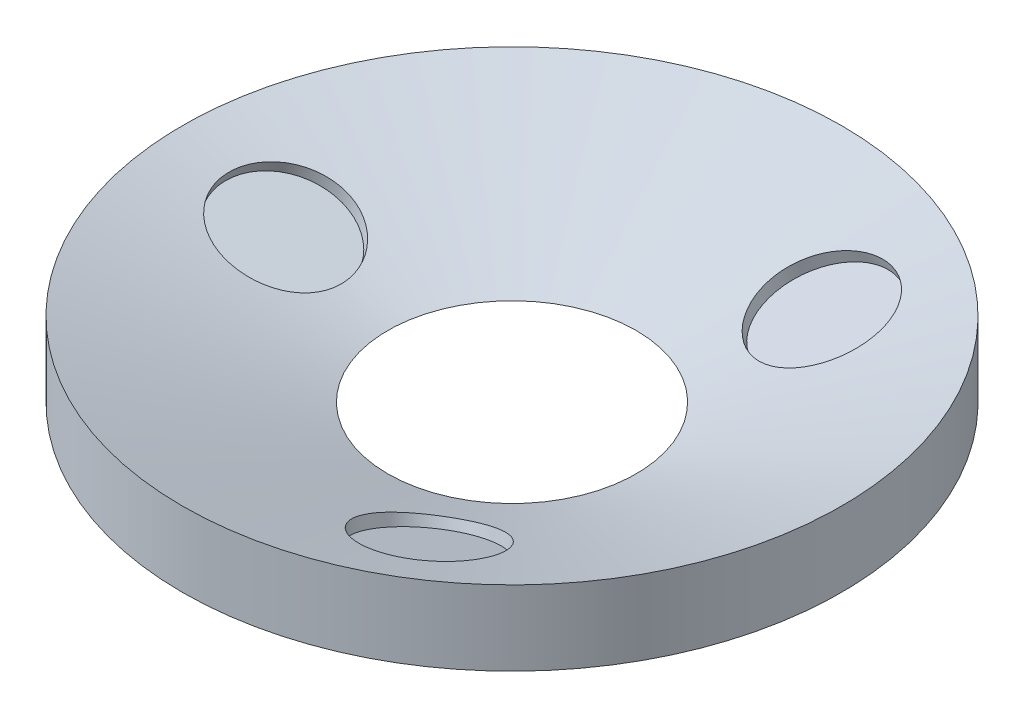
ISO-10303-21;
HEADER;
FILE_DESCRIPTION(('STEP AP214'),'2;1');
FILE_NAME('part.step','',(''),(''),'','','');
FILE_SCHEMA(('AUTOMOTIVE_DESIGN { 1 0 10303 214 1 1 1 1 }'));
ENDSEC;
DATA;
#1=APPLICATION_CONTEXT('core data for automotive mechanical design processes');
#2=APPLICATION_PROTOCOL_DEFINITION('international standard','automotive_design',2000,#1);
#3=PRODUCT_CONTEXT('',#1,'mechanical');
#4=PRODUCT('Part','Part','',(#3));
#5=PRODUCT_RELATED_PRODUCT_CATEGORY('part','',(#4));
#6=PRODUCT_DEFINITION_FORMATION('','',#4);
#7=PRODUCT_DEFINITION_CONTEXT('part definition',#1,'design');
#8=PRODUCT_DEFINITION('design','',#6,#7);
#9=PRODUCT_DEFINITION_SHAPE('','',#8);
#10=(LENGTH_UNIT() NAMED_UNIT(*) SI_UNIT(.MILLI.,.METRE.));
#11=(NAMED_UNIT(*) PLANE_ANGLE_UNIT() SI_UNIT($,.RADIAN.));
#12=(NAMED_UNIT(*) SI_UNIT($,.STERADIAN.) SOLID_ANGLE_UNIT());
#13=UNCERTAINTY_MEASURE_WITH_UNIT(LENGTH_MEASURE(1.E-05),#10,'distance_accuracy_value','');
#14=(GEOMETRIC_REPRESENTATION_CONTEXT(3) GLOBAL_UNCERTAINTY_ASSIGNED_CONTEXT((#13)) GLOBAL_UNIT_ASSIGNED_CONTEXT((#10,
#11,#12)) REPRESENTATION_CONTEXT('',''));
#15=CARTESIAN_POINT('',(0.,0.,0.));
#16=DIRECTION('',(0.,0.,1.));
#17=DIRECTION('',(1.,0.,0.));
#18=AXIS2_PLACEMENT_3D('',#15,#16,#17);
#19=CARTESIAN_POINT('',(0.,0.,0.));
#20=DIRECTION('',(0.,1.,0.));
#21=DIRECTION('',(0.,0.,1.));
#22=AXIS2_PLACEMENT_3D('',#19,#20,#21);
#23=CONICAL_SURFACE('',#22,26.,1.22173047639604);
#24=CARTESIAN_POINT('',(0.,15.6507200734464,0.));
#25=DIRECTION('',(0.,-1.,0.));
#26=DIRECTION('',(0.,0.,-1.));
#27=AXIS2_PLACEMENT_3D('',#24,#25,#26);
#28=CIRCLE('',#27,69.);
#29=CARTESIAN_POINT('',(0.,15.6507200734464,-69.));
#30=VERTEX_POINT('',#29);
#31=EDGE_CURVE('E10',#30,#30,#28,.T.);
#32=ORIENTED_EDGE('',*,*,#31,.F.);
#33=EDGE_LOOP('',(#32));
#34=FACE_BOUND('',#33,.T.);
#35=CARTESIAN_POINT('',(0.,0.,0.));
#36=DIRECTION('',(0.,-1.,0.));
#37=DIRECTION('',(0.,0.,-1.));
#38=AXIS2_PLACEMENT_3D('',#35,#36,#37);
#39=CIRCLE('',#38,26.);
#40=CARTESIAN_POINT('',(0.,0.,-26.));
#41=VERTEX_POINT('',#40);
#42=EDGE_CURVE('E52',#41,#41,#39,.T.);
#43=ORIENTED_EDGE('',*,*,#42,.T.);
#44=EDGE_LOOP('',(#43));
#45=FACE_BOUND('',#44,.T.);
#46=CARTESIAN_POINT('',(-48.6648824369267,8.81686921798829,-12.4175025220033));
#47=CARTESIAN_POINT('',(-48.9950931227915,8.92970028979996,-12.3772225399078));
#48=CARTESIAN_POINT('',(-49.3240113731133,9.04090877423315,-12.3222351855022));
#49=CARTESIAN_POINT('',(-49.9770535959025,9.25955189976981,-12.1832306697217));
#50=CARTESIAN_POINT('',(-50.3011763541219,9.36698559422977,-12.0992062828684));
#51=CARTESIAN_POINT('',(-50.9424648534416,9.5775968115045,-11.9026388857529));
#52=CARTESIAN_POINT('',(-51.2596231259274,9.68076986055038,-11.7900667428155));
#53=CARTESIAN_POINT('',(-51.8843163814544,9.88224095996404,-11.5372571893245));
#54=CARTESIAN_POINT('',(-52.1918513851953,9.9805390208182,-11.3970198382837));
#55=CARTESIAN_POINT('',(-52.7948669511792,10.1717450389196,-11.0899691416754));
#56=CARTESIAN_POINT('',(-53.0903541756035,10.2646559874675,-10.92317074122));
#57=CARTESIAN_POINT('',(-53.6672908182578,10.4447299934216,-10.5641245830231));
#58=CARTESIAN_POINT('',(-53.9487400310327,10.5318929667085,-10.3718764529593));
#59=CARTESIAN_POINT('',(-54.4954608603386,10.7000691770928,-9.96334219331167));
#60=CARTESIAN_POINT('',(-54.7607362828263,10.7810838620894,-9.74706175299703));
#61=CARTESIAN_POINT('',(-55.2732269325638,10.9366423495319,-9.29195333535134));
#62=CARTESIAN_POINT('',(-55.5204422080982,11.0111861692781,-9.05312541830588));
#63=CARTESIAN_POINT('',(-55.9953640076766,11.1536069841588,-8.55420950845172));
#64=CARTESIAN_POINT('',(-56.223038986372,11.2214732241131,-8.29408841546503));
#65=CARTESIAN_POINT('',(-56.6567485587905,11.3501273859672,-7.75475425309283));
#66=CARTESIAN_POINT('',(-56.8627831081847,11.4109152933677,-7.47554114460064));
#67=CARTESIAN_POINT('',(-57.2516807690818,11.5251698415749,-6.89998953002352));
#68=CARTESIAN_POINT('',(-57.4345430951755,11.5786362342281,-6.60365044395892));
#69=CARTESIAN_POINT('',(-57.7757179151459,11.6780322070992,-5.99595649958366));
#70=CARTESIAN_POINT('',(-57.9340304423263,11.7239617975415,-5.68460166164379));
#71=CARTESIAN_POINT('',(-58.224795058821,11.8080679171869,-5.04934972216914));
#72=CARTESIAN_POINT('',(-58.3572683455107,11.8462508024874,-4.72546316475327));
#73=CARTESIAN_POINT('',(-58.5955179480081,11.9147609294281,-4.0672091546438));
#74=CARTESIAN_POINT('',(-58.7012942708721,11.9450881731447,-3.73284170472041));
#75=CARTESIAN_POINT('',(-58.8853482739702,11.9977679142267,-3.05601270396631));
#76=CARTESIAN_POINT('',(-58.9636263172404,12.0201205168746,-2.71355126005729));
#77=CARTESIAN_POINT('',(-59.0920915037068,12.0567641514716,-2.02297502282297));
#78=CARTESIAN_POINT('',(-59.1422786956436,12.0710551974084,-1.67486023930787));
#79=CARTESIAN_POINT('',(-59.2140974168271,12.0914962855886,-0.976276252454742));
#80=CARTESIAN_POINT('',(-59.235794786043,12.0976650984006,-0.625814365584563));
#81=CARTESIAN_POINT('',(-59.2506844914417,12.1018990382395,0.0757629878464422));
#82=CARTESIAN_POINT('',(-59.2438768732205,12.0999641782288,0.426878453360923));
#83=CARTESIAN_POINT('',(-59.2018084616218,12.0879983569221,1.12725876711));
#84=CARTESIAN_POINT('',(-59.1665479157761,12.0779674660591,1.47652363141764));
#85=CARTESIAN_POINT('',(-59.0678411051002,12.0498486356474,2.17071913213656));
#86=CARTESIAN_POINT('',(-59.0043948422807,12.0317606966733,2.51564976885701));
#87=CARTESIAN_POINT('',(-58.8498666670146,11.9876181308799,3.19841389557413));
#88=CARTESIAN_POINT('',(-58.7588098504288,11.9615707384228,3.53625353382632));
#89=CARTESIAN_POINT('',(-58.5497264926574,11.901604954276,4.20276354674748));
#90=CARTESIAN_POINT('',(-58.4316999757698,11.8676865696775,4.53143392967704));
#91=CARTESIAN_POINT('',(-58.1695621271013,11.792110635325,5.17728400967493));
#92=CARTESIAN_POINT('',(-58.0254506040067,11.7504530288097,5.49446362244671));
#93=CARTESIAN_POINT('',(-57.7122208540447,11.6595617010654,6.11509238700896));
#94=CARTESIAN_POINT('',(-57.5431025864547,11.6103279674991,6.41854151643876));
#95=CARTESIAN_POINT('',(-57.1808346834279,11.5043950131912,7.01003700927711));
#96=CARTESIAN_POINT('',(-56.9876477599018,11.4476842005503,7.29805845928199));
#97=CARTESIAN_POINT('',(-56.5788895001451,11.3270828256693,7.85615483110361));
#98=CARTESIAN_POINT('',(-56.3633181441284,11.2631922570829,8.12622973705667));
#99=CARTESIAN_POINT('',(-55.9113858260012,11.1284880411246,8.64653530501179));
#100=CARTESIAN_POINT('',(-55.6750245998558,11.057674305826,8.89676571490847));
#101=CARTESIAN_POINT('',(-55.1832604096045,10.9094144459762,9.37561805353446));
#102=CARTESIAN_POINT('',(-54.92785741882,10.8319683121326,9.60423995198796));
#103=CARTESIAN_POINT('',(-54.399313108855,10.6705911207871,10.0387399801321));
#104=CARTESIAN_POINT('',(-54.126134253971,10.5866462646529,10.244567327756));
#105=CARTESIAN_POINT('',(-53.5645558607898,10.4127815768269,10.6314440367663));
#106=CARTESIAN_POINT('',(-53.2761562971058,10.3228617351693,10.8124933568233));
#107=CARTESIAN_POINT('',(-52.6862603014054,10.1374457394397,11.1485276924738));
#108=CARTESIAN_POINT('',(-52.3847638212957,10.0419495648904,11.3035126123457));
#109=CARTESIAN_POINT('',(-51.7708943155517,9.84582010804752,11.586310677145));
#110=CARTESIAN_POINT('',(-51.4585212983726,9.74518682974731,11.7141238431946));
#111=CARTESIAN_POINT('',(-50.8252202556476,9.53927211444439,11.9416521159608));
#112=CARTESIAN_POINT('',(-50.5042928722142,9.43399102593104,12.0413693251666));
#113=CARTESIAN_POINT('',(-49.8562205674092,9.21930006681213,12.2119970813682));
#114=CARTESIAN_POINT('',(-49.5290756442112,9.1098901949937,12.2829076199017));
#115=CARTESIAN_POINT('',(-48.8709784202367,8.88751793856807,12.3954032712119));
#116=CARTESIAN_POINT('',(-48.5400261785894,8.77455560908484,12.4369888387938));
#117=CARTESIAN_POINT('',(-47.8767403373077,8.54570212954013,12.4905280201258));
#118=CARTESIAN_POINT('',(-47.5444067411763,8.42981098690204,12.5024817089735));
#119=CARTESIAN_POINT('',(-46.8817392867905,8.1961114648469,12.4966719096352));
#120=CARTESIAN_POINT('',(-46.5514024289007,8.07830948510409,12.4789929518654));
#121=CARTESIAN_POINT('',(-45.8941757810166,7.84119431993168,12.4142007440052));
#122=CARTESIAN_POINT('',(-45.5672859843652,7.72188113742162,12.3670875507712));
#123=CARTESIAN_POINT('',(-44.919319550218,7.48252754146605,12.243765135921));
#124=CARTESIAN_POINT('',(-44.5982428087908,7.36248714107378,12.167556435042));
#125=CARTESIAN_POINT('',(-43.9641962332104,7.122514250412,11.9865929780768));
#126=CARTESIAN_POINT('',(-43.6512263910743,7.00258176003635,11.8818382501011));
#127=CARTESIAN_POINT('',(-43.036291414456,6.76398044557222,11.6448031923014));
#128=CARTESIAN_POINT('',(-42.7343034969633,6.64530941521586,11.5125841800413));
#129=CARTESIAN_POINT('',(-42.1427070210352,6.40990012589496,11.2214325452336));
#130=CARTESIAN_POINT('',(-41.8530984396221,6.29316186334317,11.0624999722728));
#131=CARTESIAN_POINT('',(-41.2882374263181,6.06260174879712,10.7190583553623));
#132=CARTESIAN_POINT('',(-41.0129851731291,5.94877993311458,10.5345489931475));
#133=CARTESIAN_POINT('',(-40.4786861633624,5.72508128446294,10.1412703550215));
#134=CARTESIAN_POINT('',(-40.2196394516797,5.61520446242318,9.93250101190616));
#135=CARTESIAN_POINT('',(-39.7188939631358,5.40021766898169,9.49168924068255));
#136=CARTESIAN_POINT('',(-39.4772351796846,5.29511887954718,9.25959592847799));
#137=CARTESIAN_POINT('',(-39.0134611069471,5.09104227106691,8.7741650502372));
#138=CARTESIAN_POINT('',(-38.7913458455098,4.99206446074348,8.52082745392934));
#139=CARTESIAN_POINT('',(-38.3680505303743,4.80132804297512,7.99467707312134));
#140=CARTESIAN_POINT('',(-38.1668711770831,4.70956967708038,7.72186363757513));
#141=CARTESIAN_POINT('',(-37.7866955629495,4.5343683762624,7.15867462725896));
#142=CARTESIAN_POINT('',(-37.6076993555626,4.45092546137727,6.86829901017133));
#143=CARTESIAN_POINT('',(-37.2723348469344,4.29311656115784,6.27087429498278));
#144=CARTESIAN_POINT('',(-37.1160552436626,4.21878632457431,5.96376595396584));
#145=CARTESIAN_POINT('',(-36.8278755596765,4.08058841613734,5.33605127135391));
#146=CARTESIAN_POINT('',(-36.6959755475778,4.01672077373062,5.01544489177218));
#147=CARTESIAN_POINT('',(-36.4573403272072,3.90037326657778,4.36300666453637));
#148=CARTESIAN_POINT('',(-36.350604376893,3.84789306604045,4.03117514822108));
#149=CARTESIAN_POINT('',(-36.1629202781485,3.75511666605222,3.3586343921139));
#150=CARTESIAN_POINT('',(-36.081972019572,3.71482041456043,3.01792519024772));
#151=CARTESIAN_POINT('',(-35.946531564073,3.64714846233853,2.33105216528277));
#152=CARTESIAN_POINT('',(-35.8919640739146,3.61973599635978,1.98490681220235));
#153=CARTESIAN_POINT('',(-35.8092567878069,3.57810718814616,1.28868686497938));
#154=CARTESIAN_POINT('',(-35.7811169462111,3.5638908231186,0.938612277624561));
#155=CARTESIAN_POINT('',(-35.751428868186,3.54889067951284,0.237061968675151));
#156=CARTESIAN_POINT('',(-35.7498797592786,3.5481064602077,-0.114413706569349));
#157=CARTESIAN_POINT('',(-35.7733799822381,3.55998265925975,-0.816246006471312));
#158=CARTESIAN_POINT('',(-35.7984292244588,3.57264303230372,-1.16660263489638));
#159=CARTESIAN_POINT('',(-35.874758525538,3.6110857858875,-1.86165953074585));
#160=CARTESIAN_POINT('',(-35.9258859897556,3.63679182638416,-2.2063807957734));
#161=CARTESIAN_POINT('',(-36.0539940574261,3.70086943150724,-2.88978718595772));
#162=CARTESIAN_POINT('',(-36.1309745582656,3.73924094586311,-3.22847233506683));
#163=CARTESIAN_POINT('',(-36.3103488508373,3.82804978632673,-3.89743677825621));
#164=CARTESIAN_POINT('',(-36.412743472785,3.8784875066052,-4.22771579734063));
#165=CARTESIAN_POINT('',(-36.6423538407988,3.9906694363056,-4.87755161456702));
#166=CARTESIAN_POINT('',(-36.7695697033122,4.05241369877133,-5.19710836239794));
#167=CARTESIAN_POINT('',(-37.0485540193945,4.18655115757706,-5.82433997628492));
#168=CARTESIAN_POINT('',(-37.2004040180151,4.25897964652534,-6.13197102451917));
#169=CARTESIAN_POINT('',(-37.5274499529191,4.41334301777874,-6.73206379153314));
#170=CARTESIAN_POINT('',(-37.7026459293731,4.49527791644113,-7.02452548421035));
#171=CARTESIAN_POINT('',(-38.0753282381567,4.66760354158892,-7.59224280039702));
#172=CARTESIAN_POINT('',(-38.2728142283982,4.75799413829979,-7.86749868786591));
#173=CARTESIAN_POINT('',(-38.6888694580423,4.94614791351407,-8.39889341035541));
#174=CARTESIAN_POINT('',(-38.9074387382806,5.04391110629721,-8.65503220834688));
#175=CARTESIAN_POINT('',(-39.3654838721572,5.24623964953843,-9.14768227094203));
#176=CARTESIAN_POINT('',(-39.605062646224,5.35083776382672,-9.3840844071559));
#177=CARTESIAN_POINT('',(-40.1025943104652,5.5652698115267,-9.83408351114019));
#178=CARTESIAN_POINT('',(-40.3605473374738,5.67510378392815,-10.0476803090482));
#179=CARTESIAN_POINT('',(-40.8931784011346,5.89894717305552,-10.4505832945542));
#180=CARTESIAN_POINT('',(-41.1678601527936,6.01295751498583,-10.6398840574294));
#181=CARTESIAN_POINT('',(-41.7320321700914,6.24407633996042,-10.9927709479283));
#182=CARTESIAN_POINT('',(-42.0215221693345,6.36118476725284,-11.1563575379264));
#183=CARTESIAN_POINT('',(-42.612803789752,6.59728722564656,-11.4563735980324));
#184=CARTESIAN_POINT('',(-42.9145732492128,6.71627764183593,-11.5928495873289));
#185=CARTESIAN_POINT('',(-43.5287673957663,6.95538436368785,-11.8380075992807));
#186=CARTESIAN_POINT('',(-43.8411920977968,7.07550067092863,-11.9466895829692));
#187=CARTESIAN_POINT('',(-44.4741635686113,7.31583509082915,-12.135373465774));
#188=CARTESIAN_POINT('',(-44.7947017750968,7.4360529765464,-12.2154043519409));
#189=CARTESIAN_POINT('',(-45.4417942857952,7.67582445218705,-12.3463446648247));
#190=CARTESIAN_POINT('',(-45.7683470797195,7.79537819932308,-12.3972613020633));
#191=CARTESIAN_POINT('',(-46.521967784013,8.06807806094624,-12.4802864290212));
#192=CARTESIAN_POINT('',(-46.9503359636555,8.22075645227233,-12.5024508458065));
#193=CARTESIAN_POINT('',(-47.8081515799236,8.52215189146659,-12.4971193776293));
#194=CARTESIAN_POINT('',(-48.2375990121174,8.67086895557299,-12.469623696265));
#195=CARTESIAN_POINT('',(-48.6648824369267,8.81686921798829,-12.4175025220033));
#196=B_SPLINE_CURVE_WITH_KNOTS('',3,(#46,#47,#48,#49,#50,#51,#52,#53,#54,#55,#56,#57,#58,#59,
#60,#61,#62,#63,#64,#65,#66,#67,#68,#69,#70,#71,#72,#73,#74,#75,#76,#77,#78,#79,#80,#81,#82,#83,
#84,#85,#86,#87,#88,#89,#90,#91,#92,#93,#94,#95,#96,#97,#98,#99,#100,#101,#102,#103,#104,#105,
#106,#107,#108,#109,#110,#111,#112,#113,#114,#115,#116,#117,#118,#119,#120,#121,#122,#123,#124,
#125,#126,#127,#128,#129,#130,#131,#132,#133,#134,#135,#136,#137,#138,#139,#140,#141,#142,#143,
#144,#145,#146,#147,#148,#149,#150,#151,#152,#153,#154,#155,#156,#157,#158,#159,#160,#161,#162,
#163,#164,#165,#166,#167,#168,#169,#170,#171,#172,#173,#174,#175,#176,#177,#178,#179,#180,#181,
#182,#183,#184,#185,#186,#187,#188,#189,#190,#191,#192,#193,#194,#195),.UNSPECIFIED.,.T.,.F.,(4,
2,2,2,2,2,2,2,2,2,2,2,2,2,2,2,2,2,2,2,2,2,2,2,2,2,2,2,2,2,2,2,2,2,2,2,2,2,2,2,2,2,2,2,2,2,2,2,2,
2,2,2,2,2,2,2,2,2,2,2,2,2,2,2,2,2,2,2,2,2,2,2,2,2,4),(0.,1.05341948701839,2.10710129240204,
3.16186272628863,4.2166218912236,5.27078965807819,6.32497284880829,7.37890700791343,
8.4328383491756,9.4884403231196,10.5440444593455,11.5996843650972,12.6553228387784,
13.7100916368675,14.7648601561711,15.8196147497555,16.8743675132257,17.9266784281767,
18.9789876598784,20.0312877369136,21.0835877388822,22.1349341339608,23.18627958185,
24.2376327408715,25.2889876120035,26.3419920232222,27.3949973652223,28.4480160825082,
29.5010362751636,30.556357114684,31.6116797144449,32.6670061897952,33.7223318447704,
34.7775785061526,35.8328254775216,36.8880560825511,37.9432840132575,38.9955069091675,
40.0477277725694,41.099929804724,42.1521308007383,43.202007396789,44.2518820440386,
45.3017697565889,46.3516603775616,47.4038933498114,48.4561278214457,49.5083974840766,
50.5606696823482,51.6169460954435,52.673225481353,53.7294737156184,54.785717438304,
55.8389284775839,56.8921376977247,57.945312360576,58.9984834738525,60.0455615529114,
61.0926354760607,62.1397436089902,63.1868566544749,64.2375094131261,65.2881639796172,
66.338802423743,67.3894429028667,68.4455532738949,69.5016715106673,70.5580251446457,
71.6143597818331,72.6688658887234,73.7233734740061,74.7768111516169,75.8299878185857,
77.1930888653267,78.5561843235953),.UNSPECIFIED.);
#197=CARTESIAN_POINT('',(-48.6648824369267,8.81686921798829,-12.4175025220033));
#198=VERTEX_POINT('',#197);
#199=EDGE_CURVE('E56',#198,#198,#196,.T.);
#200=ORIENTED_EDGE('',*,*,#199,.F.);
#201=EDGE_LOOP('',(#200));
#202=FACE_BOUND('',#201,.T.);
#203=CARTESIAN_POINT('',(15.5165476099296,3.70450171632179,32.6815996152435));
#204=CARTESIAN_POINT('',(15.2573701294824,3.74114082698005,32.9160908900934));
#205=CARTESIAN_POINT('',(15.007757966053,3.78409842142012,33.1600940379707));
#206=CARTESIAN_POINT('',(14.5293344214469,3.88199343424077,33.6656237065946));
#207=CARTESIAN_POINT('',(14.3005283634322,3.93693390624394,33.9271546822058));
#208=CARTESIAN_POINT('',(13.8652666172777,4.05802780574882,34.4662200944874));
#209=CARTESIAN_POINT('',(13.658834870547,4.12419305381691,34.7437711961874));
#210=CARTESIAN_POINT('',(13.2701219396249,4.26675291592289,35.3128086591318));
#211=CARTESIAN_POINT('',(13.0878407470286,4.3431475264007,35.6042950155265));
#212=CARTESIAN_POINT('',(12.7488961365407,4.5050889818341,36.1991136304171));
#213=CARTESIAN_POINT('',(12.5922168689948,4.59063010967172,36.5024384147603));
#214=CARTESIAN_POINT('',(12.3055173557924,4.76982743077192,37.1191296750209));
#215=CARTESIAN_POINT('',(12.1754974996781,4.86348374258356,37.4324962975905));
#216=CARTESIAN_POINT('',(11.9431454683428,5.05778191393063,38.0671294697661));
#217=CARTESIAN_POINT('',(11.8408062843994,5.15842199705658,38.3883939971134));
#218=CARTESIAN_POINT('',(11.6645739226009,5.3656009980793,39.0367693966687));
#219=CARTESIAN_POINT('',(11.5906806523154,5.47213989680752,39.3638802498764));
#220=CARTESIAN_POINT('',(11.471833127951,5.69021537715378,40.0223366581532));
#221=CARTESIAN_POINT('',(11.4269303135938,5.80176046870529,40.353688682381));
#222=CARTESIAN_POINT('',(11.3666604562422,6.02859896623535,41.0177946988254));
#223=CARTESIAN_POINT('',(11.3512934820499,6.14389238094481,41.350548694306));
#224=CARTESIAN_POINT('',(11.3502632965313,6.37719297736756,42.0151583975844));
#225=CARTESIAN_POINT('',(11.3646006695669,6.49520021242361,42.3470140875816));
#226=CARTESIAN_POINT('',(11.4229221793625,6.73293394346181,43.0074885460072));
#227=CARTESIAN_POINT('',(11.4669062075876,6.85266043314827,43.3361073262812));
#228=CARTESIAN_POINT('',(11.5840131745744,7.09243898584826,43.986546393769));
#229=CARTESIAN_POINT('',(11.6570259357131,7.21248813233163,44.30838759648));
#230=CARTESIAN_POINT('',(11.8316824123654,7.45247969379346,44.9442457251939));
#231=CARTESIAN_POINT('',(11.9333260634533,7.57242210901148,45.2582626688013));
#232=CARTESIAN_POINT('',(12.1645148776548,7.81137526885763,45.8762133029251));
#233=CARTESIAN_POINT('',(12.2940597146783,7.93038602435751,46.1801471112384));
#234=CARTESIAN_POINT('',(12.5801108907024,8.1667092066317,46.7757391148976));
#235=CARTESIAN_POINT('',(12.7366172122614,8.28402163450461,47.0673973181847));
#236=CARTESIAN_POINT('',(13.0750661437868,8.51597369477807,47.6356806372132));
#237=CARTESIAN_POINT('',(13.2569507468577,8.63061874567387,47.912338091924));
#238=CARTESIAN_POINT('',(13.6450960100402,8.85685334912113,48.4493191023801));
#239=CARTESIAN_POINT('',(13.8513566233474,8.96844290753895,48.7096426894867));
#240=CARTESIAN_POINT('',(14.2867543275629,9.18796400495957,49.2120656760494));
#241=CARTESIAN_POINT('',(14.5158915689846,9.29589551988857,49.4541649555829));
#242=CARTESIAN_POINT('',(14.9953786951925,9.5075456340319,49.9183734373151));
#243=CARTESIAN_POINT('',(15.2457286314803,9.61126422301692,50.1404825909776));
#244=CARTESIAN_POINT('',(15.7663967780919,9.81420106306111,50.5635464169938));
#245=CARTESIAN_POINT('',(16.0367572426983,9.91340903323875,50.7644540187329));
#246=CARTESIAN_POINT('',(16.5950089869692,10.1066161884984,51.1430787822913));
#247=CARTESIAN_POINT('',(16.8829002864561,10.2006153676906,51.3207959178882));
#248=CARTESIAN_POINT('',(17.4741434075905,10.3829805276863,51.6517234496464));
#249=CARTESIAN_POINT('',(17.7774954696637,10.4713464208402,51.8049334645514));
#250=CARTESIAN_POINT('',(18.3974768383891,10.642056502472,52.0856963533362));
#251=CARTESIAN_POINT('',(18.7141061681561,10.7244006804659,52.2132491825464));
#252=CARTESIAN_POINT('',(19.3592942376813,10.8829432846929,52.4420565154391));
#253=CARTESIAN_POINT('',(19.6878844772248,10.9591234791203,52.5432348385035));
#254=CARTESIAN_POINT('',(20.3537724018663,11.1047570994025,52.7180267658652));
#255=CARTESIAN_POINT('',(20.6910701050441,11.1742105112888,52.7916403129235));
#256=CARTESIAN_POINT('',(21.3719489427129,11.3061060879252,52.9107108370711));
#257=CARTESIAN_POINT('',(21.7155300924265,11.3685482356868,52.9561677459373));
#258=CARTESIAN_POINT('',(22.4065056289683,11.4861690348425,53.0185339622102));
#259=CARTESIAN_POINT('',(22.7539000130051,11.5413476915534,53.035443290514));
#260=CARTESIAN_POINT('',(23.4500476928742,11.6442276832073,53.0405299849402));
#261=CARTESIAN_POINT('',(23.7988011492448,11.6919281055558,53.0287038472767));
#262=CARTESIAN_POINT('',(24.4951161304437,11.7796547125784,52.9763371173927));
#263=CARTESIAN_POINT('',(24.8426776547628,11.8196808939743,52.9357965129068));
#264=CARTESIAN_POINT('',(25.5341033682824,11.8919010639111,52.8262381662847));
#265=CARTESIAN_POINT('',(25.8779675946655,11.9240951312874,52.7572207108063));
#266=CARTESIAN_POINT('',(26.5595258876089,11.980525274365,52.5911578921333));
#267=CARTESIAN_POINT('',(26.8972199658418,12.0047613651225,52.4941125819674));
#268=CARTESIAN_POINT('',(27.5632831902618,12.0451369093595,52.272894795713));
#269=CARTESIAN_POINT('',(27.891670974457,12.0612938113733,52.1487816182722));
#270=CARTESIAN_POINT('',(28.5375302322144,12.0855268873184,51.8741683698556));
#271=CARTESIAN_POINT('',(28.855001720843,12.0936030724028,51.7236683353002));
#272=CARTESIAN_POINT('',(29.4767549074144,12.1016432805627,51.3973450124679));
#273=CARTESIAN_POINT('',(29.7810367355028,12.1016073837002,51.2215219741331));
#274=CARTESIAN_POINT('',(30.3742432073142,12.093423765254,50.8458058958169));
#275=CARTESIAN_POINT('',(30.6631678618733,12.085276049394,50.6459128728197));
#276=CARTESIAN_POINT('',(31.2231600040797,12.0609199212935,50.2238300934404));
#277=CARTESIAN_POINT('',(31.4942551676905,12.0447243526028,50.0016763124895));
#278=CARTESIAN_POINT('',(32.0171774777218,12.0043416696012,49.5364077584824));
#279=CARTESIAN_POINT('',(32.2690046495393,11.980154565824,49.2932930130553));
#280=CARTESIAN_POINT('',(32.7516253084473,11.9238826934917,48.7878580729234));
#281=CARTESIAN_POINT('',(32.9824187478716,11.8917979070395,48.5255378346978));
#282=CARTESIAN_POINT('',(33.4213631889923,11.8198555683898,47.9835903723448));
#283=CARTESIAN_POINT('',(33.6295141624939,11.7799980065137,47.703963126667));
#284=CARTESIAN_POINT('',(34.0219063700283,11.6926273542356,47.1291734343259));
#285=CARTESIAN_POINT('',(34.2061263907059,11.6451075542121,46.8339975260457));
#286=CARTESIAN_POINT('',(34.5491755246139,11.5426244977947,46.2304776946755));
#287=CARTESIAN_POINT('',(34.708004629142,11.4876612388498,45.9221337670723));
#288=CARTESIAN_POINT('',(34.9991926592667,11.3705085939709,45.2945093777488));
#289=CARTESIAN_POINT('',(35.1315512574644,11.3083191186749,44.9752287808162));
#290=CARTESIAN_POINT('',(35.3689050459091,11.1769640844197,44.3280478939159));
#291=CARTESIAN_POINT('',(35.4739001889047,11.1077985134143,44.0001475890647));
#292=CARTESIAN_POINT('',(35.6560411377453,10.9626048045078,43.3373345880014));
#293=CARTESIAN_POINT('',(35.7331218305194,10.8865611321611,43.0024074000479));
#294=CARTESIAN_POINT('',(35.8585898459459,10.7280655436352,42.328716458453));
#295=CARTESIAN_POINT('',(35.906977121486,10.6456136169345,41.9899526985131));
#296=CARTESIAN_POINT('',(35.9747568562584,10.4746531628947,41.3110521575723));
#297=CARTESIAN_POINT('',(35.9941490642695,10.3861445830861,40.9709153647007));
#298=CARTESIAN_POINT('',(36.0038385158801,10.2034608205298,40.2917506410967));
#299=CARTESIAN_POINT('',(35.994135759418,10.1092856377701,39.9527227103668));
#300=CARTESIAN_POINT('',(35.9457181106732,9.91561475357106,39.2779628941369));
#301=CARTESIAN_POINT('',(35.9069785465829,9.81611459443958,38.9422340576942));
#302=CARTESIAN_POINT('',(35.8007653285197,9.6123386972571,38.2768244624783));
#303=CARTESIAN_POINT('',(35.73329164799,9.50806295479248,37.9471437092952));
#304=CARTESIAN_POINT('',(35.570120051424,9.29525331543753,37.2962533695446));
#305=CARTESIAN_POINT('',(35.4744224448024,9.1867194652395,36.9750436901521));
#306=CARTESIAN_POINT('',(35.2555114353478,8.96595631298328,36.3434528872139));
#307=CARTESIAN_POINT('',(35.1322980943033,8.85372701922395,36.0330717393537));
#308=CARTESIAN_POINT('',(34.8595591805786,8.62643584505997,35.4260855554704));
#309=CARTESIAN_POINT('',(34.7100917779924,8.51138070075741,35.129451859023));
#310=CARTESIAN_POINT('',(34.3857494839057,8.27886412299589,34.5514082375105));
#311=CARTESIAN_POINT('',(34.2108746263653,8.16140269275338,34.2699982920978));
#312=CARTESIAN_POINT('',(33.8369889630208,7.92479176004787,33.7244604039785));
#313=CARTESIAN_POINT('',(33.6379786112858,7.80564228937976,33.4603321362898));
#314=CARTESIAN_POINT('',(33.2172580204898,7.56642447554617,32.9512682864643));
#315=CARTESIAN_POINT('',(32.9955478239405,7.44635613410191,32.7063326683853));
#316=CARTESIAN_POINT('',(32.5317047181598,7.20647943611611,32.2381014688245));
#317=CARTESIAN_POINT('',(32.2896334939781,7.08667134743312,32.0147446376732));
#318=CARTESIAN_POINT('',(31.7862358511061,6.8478380466777,31.5904362382313));
#319=CARTESIAN_POINT('',(31.5249094763548,6.72881283281947,31.3894846188161));
#320=CARTESIAN_POINT('',(30.9848499389972,6.49247139691862,31.0113757835576));
#321=CARTESIAN_POINT('',(30.7061167428033,6.37515517817415,30.8342186136294));
#322=CARTESIAN_POINT('',(30.1332000670144,6.14320717800131,30.5048927314149));
#323=CARTESIAN_POINT('',(29.8390165614652,6.02857540108286,30.3527240611073));
#324=CARTESIAN_POINT('',(29.2370195492754,5.80293085001509,30.074261401386));
#325=CARTESIAN_POINT('',(28.9291959860647,5.69192085446817,29.9479869026823));
#326=CARTESIAN_POINT('',(28.3022471938424,5.47466771019923,29.7222404523154));
#327=CARTESIAN_POINT('',(27.9831219597853,5.36842456360543,29.6227685126185));
#328=CARTESIAN_POINT('',(27.3357492165591,5.16178905562175,29.451202847565));
#329=CARTESIAN_POINT('',(27.0075017143965,5.0613966897383,29.379109101181));
#330=CARTESIAN_POINT('',(26.3441064813311,4.86755933058973,29.2626686574612));
#331=CARTESIAN_POINT('',(26.0089587337327,4.77411435413679,29.2183220272695));
#332=CARTESIAN_POINT('',(25.3326393905057,4.59489906991492,29.1574190413525));
#333=CARTESIAN_POINT('',(24.9914487846586,4.50916166091239,29.1409769102432));
#334=CARTESIAN_POINT('',(24.3066920267018,4.34687262380516,29.1362057201096));
#335=CARTESIAN_POINT('',(23.9631258586601,4.2703210573697,29.1478768498128));
#336=CARTESIAN_POINT('',(23.2758687602723,4.12741568246852,29.1991150785923));
#337=CARTESIAN_POINT('',(22.9321778193896,4.06106421866836,29.2386885798551));
#338=CARTESIAN_POINT('',(22.2470991803077,3.93952680778669,29.3453268670973));
#339=CARTESIAN_POINT('',(21.9057114429935,3.88434067062221,29.4123911850033));
#340=CARTESIAN_POINT('',(21.2275226501594,3.78595303432031,29.5734339323035));
#341=CARTESIAN_POINT('',(20.8907224016488,3.74275361858576,29.6674170346694));
#342=CARTESIAN_POINT('',(20.2241171944653,3.66903071780028,29.8815250611247));
#343=CARTESIAN_POINT('',(19.8943122263838,3.63850721569966,30.0016499500519));
#344=CARTESIAN_POINT('',(19.2443572600837,3.59065831912167,30.2669749692391));
#345=CARTESIAN_POINT('',(18.92419752679,3.57331915747661,30.4121487483453));
#346=CARTESIAN_POINT('',(18.2955616286666,3.55207377066445,30.7265122464957));
#347=CARTESIAN_POINT('',(17.9870825139095,3.54816413120511,30.895695849943));
#348=CARTESIAN_POINT('',(17.2982988700254,3.55465125211154,31.3081770247232));
#349=CARTESIAN_POINT('',(16.9224374452054,3.5694200981078,31.5588856032972));
#350=CARTESIAN_POINT('',(16.1979752948526,3.6208200291697,32.095034135852));
#351=CARTESIAN_POINT('',(15.8493744576943,3.6574510247098,32.3804739476047));
#352=CARTESIAN_POINT('',(15.5165476099296,3.70450171632179,32.6815996152435));
#353=B_SPLINE_CURVE_WITH_KNOTS('',3,(#203,#204,#205,#206,#207,#208,#209,#210,#211,#212,#213,
#214,#215,#216,#217,#218,#219,#220,#221,#222,#223,#224,#225,#226,#227,#228,#229,#230,#231,#232,
#233,#234,#235,#236,#237,#238,#239,#240,#241,#242,#243,#244,#245,#246,#247,#248,#249,#250,#251,
#252,#253,#254,#255,#256,#257,#258,#259,#260,#261,#262,#263,#264,#265,#266,#267,#268,#269,#270,
#271,#272,#273,#274,#275,#276,#277,#278,#279,#280,#281,#282,#283,#284,#285,#286,#287,#288,#289,
#290,#291,#292,#293,#294,#295,#296,#297,#298,#299,#300,#301,#302,#303,#304,#305,#306,#307,#308,
#309,#310,#311,#312,#313,#314,#315,#316,#317,#318,#319,#320,#321,#322,#323,#324,#325,#326,#327,
#328,#329,#330,#331,#332,#333,#334,#335,#336,#337,#338,#339,#340,#341,#342,#343,#344,#345,#346,
#347,#348,#349,#350,#351,#352),.UNSPECIFIED.,.T.,.F.,(4,2,2,2,2,2,2,2,2,2,2,2,2,2,2,2,2,2,2,2,2,
2,2,2,2,2,2,2,2,2,2,2,2,2,2,2,2,2,2,2,2,2,2,2,2,2,2,2,2,2,2,2,2,2,2,2,2,2,2,2,2,2,2,2,2,2,2,2,2,
2,2,2,2,2,4),(0.,1.05388587359173,2.1080406256388,3.16331245537042,4.21858391784206,
5.27319958662904,6.32783066415903,7.382194459505,8.43655482883574,9.49278091639614,
10.5490094643792,11.6052587913311,12.661504251429,13.7137784618978,14.7660503045451,
15.8183098496274,16.8705687139985,17.9204606829244,18.9703506359807,20.020247497086,
21.0701469072716,22.1223302712156,23.1745148248956,24.2267157457716,25.278918498532,
26.3341275953897,27.3893388834088,28.4445527281733,29.4997658005108,30.5551075440297,
31.6104497383434,32.6657813094821,33.7211108839438,34.7741513233157,35.8271903092359,
36.880218902201,37.9332467521381,38.984599448608,40.0359507592831,41.0873044524583,
42.1386594547819,43.1909401515536,44.2432212089788,45.2955152806764,46.3478111694752,
47.4025460631016,48.4572826885163,49.5120284524102,50.566774218536,51.6224171916024,
52.6780611403244,53.7336935166118,54.7893235224272,55.8426434533519,56.8959619764084,
57.9492606861026,59.002557423233,60.0527707580569,61.1029816964344,62.1531946613231,
63.2034093904608,64.2544117446143,65.3054145679949,66.3564165841638,67.4074211435996,
68.462717612737,69.5180211662189,70.5735669374538,71.6290947371443,72.6848058825571,
73.7405156079848,74.7951214353332,75.8494591221587,77.2028288245374,78.5561929849037),.UNSPECIFIED.);
#354=CARTESIAN_POINT('',(15.5165476099296,3.70450171632179,32.6815996152435));
#355=VERTEX_POINT('',#354);
#356=EDGE_CURVE('E63',#355,#355,#353,.T.);
#357=ORIENTED_EDGE('',*,*,#356,.F.);
#358=EDGE_LOOP('',(#357));
#359=FACE_BOUND('',#358,.T.);
#360=CARTESIAN_POINT('',(13.564979125872,8.80918930607026,-48.3356746130957));
#361=CARTESIAN_POINT('',(13.366258573996,8.69669670258512,-48.0704319046798));
#362=CARTESIAN_POINT('',(13.1796156621154,8.58263293933565,-47.7968763398318));
#363=CARTESIAN_POINT('',(12.8317148630315,8.35193968787535,-47.2349632995843));
#364=CARTESIAN_POINT('',(12.6704629728582,8.23530960092358,-46.9466023486071));
#365=CARTESIAN_POINT('',(12.3744522713575,8.00010507397167,-46.3569642784857));
#366=CARTESIAN_POINT('',(12.2397190681409,7.88152887320079,-46.0556750135147));
#367=CARTESIAN_POINT('',(11.9979110682722,7.64329360263662,-45.4426079185704));
#368=CARTESIAN_POINT('',(11.8908361269119,7.52363453851229,-45.1308301434828));
#369=CARTESIAN_POINT('',(11.7051533446743,7.28409510480028,-44.4991599510775));
#370=CARTESIAN_POINT('',(11.6265331707213,7.16421485378075,-44.1792711138031));
#371=CARTESIAN_POINT('',(11.4982429104057,6.92504229460072,-43.5335191092876));
#372=CARTESIAN_POINT('',(11.4485732324567,6.80574999475818,-43.2076558578306));
#373=CARTESIAN_POINT('',(11.3785210145901,6.56869751063631,-42.5523287302585));
#374=CARTESIAN_POINT('',(11.358131948784,6.4509369907626,-42.2228656729454));
#375=CARTESIAN_POINT('',(11.34672380546,6.21788635459338,-41.5625621336445));
#376=CARTESIAN_POINT('',(11.3557046529096,6.10259623198743,-41.2317216551779));
#377=CARTESIAN_POINT('',(11.402932341035,5.87542859177193,-40.5707393328992));
#378=CARTESIAN_POINT('',(11.44119656155,5.76355314180789,-40.2405980207716));
#379=CARTESIAN_POINT('',(11.5466761086835,5.54433631508785,-39.5834505746611));
#380=CARTESIAN_POINT('',(11.6138914678445,5.43699494342852,-39.2564444442028));
#381=CARTESIAN_POINT('',(11.7767323988356,5.22791797371883,-38.6077327170288));
#382=CARTESIAN_POINT('',(11.8723598512768,5.12618274727068,-38.2860274726697));
#383=CARTESIAN_POINT('',(12.0912746566614,4.92942040094539,-37.6500624970543));
#384=CARTESIAN_POINT('',(12.2145620990514,4.83439330276217,-37.335802789879));
#385=CARTESIAN_POINT('',(12.4884208829906,4.65176483732492,-36.7154998788394));
#386=CARTESIAN_POINT('',(12.639103001751,4.56419582098787,-36.4094960507973));
#387=CARTESIAN_POINT('',(12.966266371735,4.39801309084414,-35.8090659339739));
#388=CARTESIAN_POINT('',(13.1427477012388,4.31939940421105,-35.5146396803249));
#389=CARTESIAN_POINT('',(13.5201893546903,4.17216894759267,-34.9392870531919));
#390=CARTESIAN_POINT('',(13.7211496365632,4.10355216042499,-34.6583606565052));
#391=CARTESIAN_POINT('',(14.1460590189452,3.97728081867207,-34.1118476944073));
#392=CARTESIAN_POINT('',(14.3700080795144,3.9196262450419,-33.8462611023464));
#393=CARTESIAN_POINT('',(14.8392811566588,3.81612726900395,-33.3321418542427));
#394=CARTESIAN_POINT('',(15.0846085699923,3.77028474798189,-33.0836119195486));
#395=CARTESIAN_POINT('',(15.5948043128156,3.69113536796295,-32.6053194280446));
#396=CARTESIAN_POINT('',(15.8596726479565,3.65782851259132,-32.3755568766622));
#397=CARTESIAN_POINT('',(16.4069943328883,3.60428962891828,-31.9363803179909));
#398=CARTESIAN_POINT('',(16.689446779043,3.58405692935131,-31.7269652664707));
#399=CARTESIAN_POINT('',(17.2698856456612,3.556998865436,-31.3299322153122));
#400=CARTESIAN_POINT('',(17.5678719824534,3.55017342887865,-31.1423140982848));
#401=CARTESIAN_POINT('',(18.1752753996072,3.55004440245105,-30.7913349693723));
#402=CARTESIAN_POINT('',(18.4846076765986,3.55665504522746,-30.6278271989465));
#403=CARTESIAN_POINT('',(19.1142746678461,3.58311643094692,-30.3248363733904));
#404=CARTESIAN_POINT('',(19.4346093369147,3.60296711951821,-30.1853532196033));
#405=CARTESIAN_POINT('',(20.0840340665519,3.65558425752382,-29.9314478522325));
#406=CARTESIAN_POINT('',(20.4131242494011,3.68835088743216,-29.8170259888642));
#407=CARTESIAN_POINT('',(21.0777716292292,3.76627726375041,-29.6141288804784));
#408=CARTESIAN_POINT('',(21.4133288411299,3.81143703875901,-29.5256536953369));
#409=CARTESIAN_POINT('',(22.0884868131292,3.91343640947363,-29.3753973688587));
#410=CARTESIAN_POINT('',(22.4280860674292,3.97027177646406,-29.3136065879166));
#411=CARTESIAN_POINT('',(23.1091469136788,4.09479758974255,-29.2172209191746));
#412=CARTESIAN_POINT('',(23.4506085039578,4.16248802629546,-29.1826260069846));
#413=CARTESIAN_POINT('',(24.1331122413902,4.30778413658876,-29.1410026987854));
#414=CARTESIAN_POINT('',(24.474154375263,4.38539011650696,-29.1339751542295));
#415=CARTESIAN_POINT('',(25.153530556999,4.5494981068267,-29.1476770867525));
#416=CARTESIAN_POINT('',(25.4918645916432,4.63600016062414,-29.1684066992395));
#417=CARTESIAN_POINT('',(26.1657169101554,4.81741547136322,-29.2378444743929));
#418=CARTESIAN_POINT('',(26.5012032881608,4.9123790443632,-29.2867309549752));
#419=CARTESIAN_POINT('',(27.1648676543435,5.10913163568685,-29.4124171744825));
#420=CARTESIAN_POINT('',(27.4930456124897,5.21092068205023,-29.4892170280842));
#421=CARTESIAN_POINT('',(28.1398498739056,5.42021549025096,-29.6703232501588));
#422=CARTESIAN_POINT('',(28.4584762025459,5.52772123690183,-29.7746295455636));
#423=CARTESIAN_POINT('',(29.0839816496315,5.74735672122375,-30.010131846642));
#424=CARTESIAN_POINT('',(29.3908607869622,5.85948645146042,-30.141327809084));
#425=CARTESIAN_POINT('',(29.9908766437274,6.08735904562857,-30.4298480573408));
#426=CARTESIAN_POINT('',(30.2840068910804,6.20310356929939,-30.5871844931968));
#427=CARTESIAN_POINT('',(30.8543099096727,6.43712873500766,-30.9269015903751));
#428=CARTESIAN_POINT('',(31.1314826654622,6.5554093795004,-31.1092822759443));
#429=CARTESIAN_POINT('',(31.6678974186196,6.7935228196195,-31.4978362663308));
#430=CARTESIAN_POINT('',(31.927139737559,6.91335558736366,-31.7040091442723));
#431=CARTESIAN_POINT('',(32.4258432219071,7.15364411476869,-32.1387038807725));
#432=CARTESIAN_POINT('',(32.6653044538073,7.27409987233401,-32.3672256642027));
#433=CARTESIAN_POINT('',(33.121772697126,7.51425811523215,-32.8439949263499));
#434=CARTESIAN_POINT('',(33.3388686983008,7.63396165295077,-33.092156682864));
#435=CARTESIAN_POINT('',(33.7501755902467,7.87230549670074,-33.6072453631778));
#436=CARTESIAN_POINT('',(33.9443865434046,7.99094580562973,-33.8741722358188));
#437=CARTESIAN_POINT('',(34.3085239873657,8.22640664041067,-34.424859195422));
#438=CARTESIAN_POINT('',(34.4784505940933,8.34322717494716,-34.70861920202));
#439=CARTESIAN_POINT('',(34.7927931091532,8.5743477390043,-35.2909109280709));
#440=CARTESIAN_POINT('',(34.9372090031026,8.68864776710385,-35.5894426558518));
#441=CARTESIAN_POINT('',(35.1993723858111,8.91398382773443,-36.1988444440072));
#442=CARTESIAN_POINT('',(35.3171422838337,9.02502253412281,-36.509703876229));
#443=CARTESIAN_POINT('',(35.5253126840213,9.24334109967893,-37.1417345839243));
#444=CARTESIAN_POINT('',(35.6157132145586,9.35062096274315,-37.4629058487077));
#445=CARTESIAN_POINT('',(35.768481963402,9.5608765705339,-38.1132289770859));
#446=CARTESIAN_POINT('',(35.8308498391356,9.66385226264746,-38.4423809381568));
#447=CARTESIAN_POINT('',(35.927083914155,9.86499765388276,-39.1062724485146));
#448=CARTESIAN_POINT('',(35.9609500394491,9.96316734052733,-39.4410120123048));
#449=CARTESIAN_POINT('',(35.9999665380528,10.1545179390292,-40.1146198712411));
#450=CARTESIAN_POINT('',(36.0050341085759,10.2476837034337,-40.4534972669952));
#451=CARTESIAN_POINT('',(35.9861608224802,10.4283010790468,-41.1319662958861));
#452=CARTESIAN_POINT('',(35.9622199155038,10.5157526803356,-41.4715579302618));
#453=CARTESIAN_POINT('',(35.8854598438837,10.6845610649598,-42.1489924036587));
#454=CARTESIAN_POINT('',(35.8326403100419,10.7659177703601,-42.4868352202664));
#455=CARTESIAN_POINT('',(35.6984544786682,10.9221898717275,-43.1583154393386));
#456=CARTESIAN_POINT('',(35.6170881511676,10.9971052609325,-43.4919528373878));
#457=CARTESIAN_POINT('',(35.4261246413193,11.1403455609619,-44.1533471085777));
#458=CARTESIAN_POINT('',(35.3164641965527,11.2086552254343,-44.4810890204477));
#459=CARTESIAN_POINT('',(35.0697350822453,11.3382128320376,-45.1275279574134));
#460=CARTESIAN_POINT('',(34.9326663639335,11.3994607616022,-45.4462249664131));
#461=CARTESIAN_POINT('',(34.6320514423618,11.5146478441228,-46.0722488447102));
#462=CARTESIAN_POINT('',(34.4685053114889,11.5685870170594,-46.3795757450896));
#463=CARTESIAN_POINT('',(34.1160575471729,11.6689416741995,-46.9806175679608));
#464=CARTESIAN_POINT('',(33.9271559469714,11.7153571682666,-47.2743325082976));
#465=CARTESIAN_POINT('',(33.5254586809946,11.8004484409322,-47.8457886907806));
#466=CARTESIAN_POINT('',(33.3126813444201,11.8391300941242,-48.1235419421985));
#467=CARTESIAN_POINT('',(32.8645993635654,11.9086459235675,-48.6612926573854));
#468=CARTESIAN_POINT('',(32.6292947239846,11.9394801014557,-48.9212901248584));
#469=CARTESIAN_POINT('',(32.137813224109,11.9931799433707,-49.4216333043522));
#470=CARTESIAN_POINT('',(31.8816365722985,12.0160456869797,-49.6619792126184));
#471=CARTESIAN_POINT('',(31.3502198572758,12.0537196839347,-50.1212750212878));
#472=CARTESIAN_POINT('',(31.0749798275401,12.0685279514299,-50.340224959262));
#473=CARTESIAN_POINT('',(30.5080507595915,12.0900043025964,-50.7546618726739));
#474=CARTESIAN_POINT('',(30.2164013351339,12.0966911784043,-50.9502020664817));
#475=CARTESIAN_POINT('',(29.6181464867397,12.1019613284445,-51.3170051553584));
#476=CARTESIAN_POINT('',(29.3115410865871,12.1005446155632,-51.4882680890327));
#477=CARTESIAN_POINT('',(28.6855614037915,12.0896131384291,-51.8052977575849));
#478=CARTESIAN_POINT('',(28.3661871904526,12.0800984181234,-51.9510646308222));
#479=CARTESIAN_POINT('',(27.7169501305284,12.0530079450853,-52.2160785824871));
#480=CARTESIAN_POINT('',(27.3870872852133,12.0354321933291,-52.335325664126));
#481=CARTESIAN_POINT('',(26.719543677178,11.9923080516488,-52.5463778874103));
#482=CARTESIAN_POINT('',(26.3818704594107,11.9667670810267,-52.6382084113804));
#483=CARTESIAN_POINT('',(25.7008240259599,11.9078065539498,-52.7939600331775));
#484=CARTESIAN_POINT('',(25.3574508145434,11.8743870033928,-52.8578811518969));
#485=CARTESIAN_POINT('',(24.6674679963715,11.7998005491379,-52.9574044155121));
#486=CARTESIAN_POINT('',(24.3208584838058,11.7586338702496,-52.9930073820003));
#487=CARTESIAN_POINT('',(23.6268688358449,11.6687134750279,-53.0356986184097));
#488=CARTESIAN_POINT('',(23.2794886999178,11.619959753457,-53.0427868686465));
#489=CARTESIAN_POINT('',(22.5859381387582,11.5149813998663,-53.0284477843571));
#490=CARTESIAN_POINT('',(22.2397701758387,11.4587461108242,-53.006979372663));
#491=CARTESIAN_POINT('',(21.5516240007829,11.3390824037356,-52.9356716109045));
#492=CARTESIAN_POINT('',(21.2096458071911,11.275653953864,-52.8858321353126));
#493=CARTESIAN_POINT('',(20.5322434083191,11.1418429211706,-52.7581864208589));
#494=CARTESIAN_POINT('',(20.1968208389566,11.0714586284415,-52.6803732929633));
#495=CARTESIAN_POINT('',(19.5350229190671,10.9240380931139,-52.4974027654082));
#496=CARTESIAN_POINT('',(19.2086474510659,10.8470019369417,-52.3922457209863));
#497=CARTESIAN_POINT('',(18.566427688268,10.6863855792871,-52.1550842686437));
#498=CARTESIAN_POINT('',(18.2506135712336,10.6027885879905,-52.0230095004612));
#499=CARTESIAN_POINT('',(17.6327071760373,10.4295896275659,-51.7331933230106));
#500=CARTESIAN_POINT('',(17.3306149628458,10.3399876300105,-51.5754517922322));
#501=CARTESIAN_POINT('',(16.7426252983744,10.1552646542314,-51.2356517222656));
#502=CARTESIAN_POINT('',(16.4567121169997,10.0601492251929,-51.0536174010345));
#503=CARTESIAN_POINT('',(15.9029203804189,9.86478935484777,-50.6665394020824));
#504=CARTESIAN_POINT('',(15.6350374829454,9.7645461587802,-50.4615012963581));
#505=CARTESIAN_POINT('',(15.0380531277252,9.52711535818465,-49.9620008683174));
#506=CARTESIAN_POINT('',(14.7161555837513,9.38821427815399,-49.6596805598343));
#507=CARTESIAN_POINT('',(14.1108128804215,9.10351830584863,-49.0216293461251));
#508=CARTESIAN_POINT('',(13.8273677454878,8.95772340919558,-48.6858984196793));
#509=CARTESIAN_POINT('',(13.564979125872,8.80918930607026,-48.3356746130957));
#510=B_SPLINE_CURVE_WITH_KNOTS('',3,(#360,#361,#362,#363,#364,#365,#366,#367,#368,#369,#370,
#371,#372,#373,#374,#375,#376,#377,#378,#379,#380,#381,#382,#383,#384,#385,#386,#387,#388,#389,
#390,#391,#392,#393,#394,#395,#396,#397,#398,#399,#400,#401,#402,#403,#404,#405,#406,#407,#408,
#409,#410,#411,#412,#413,#414,#415,#416,#417,#418,#419,#420,#421,#422,#423,#424,#425,#426,#427,
#428,#429,#430,#431,#432,#433,#434,#435,#436,#437,#438,#439,#440,#441,#442,#443,#444,#445,#446,
#447,#448,#449,#450,#451,#452,#453,#454,#455,#456,#457,#458,#459,#460,#461,#462,#463,#464,#465,
#466,#467,#468,#469,#470,#471,#472,#473,#474,#475,#476,#477,#478,#479,#480,#481,#482,#483,#484,
#485,#486,#487,#488,#489,#490,#491,#492,#493,#494,#495,#496,#497,#498,#499,#500,#501,#502,#503,
#504,#505,#506,#507,#508,#509),.UNSPECIFIED.,.T.,.F.,(4,2,2,2,2,2,2,2,2,2,2,2,2,2,2,2,2,2,2,2,2,
2,2,2,2,2,2,2,2,2,2,2,2,2,2,2,2,2,2,2,2,2,2,2,2,2,2,2,2,2,2,2,2,2,2,2,2,2,2,2,2,2,2,2,2,2,2,2,2,
2,2,2,2,2,4),(0.,1.04959088473165,2.09942929857177,3.15027658137378,4.20111836601729,
5.25150414005027,6.30190473184625,7.35207118026543,8.40223494578721,9.45302247297623,
10.5038111813048,11.5546694573779,12.6055311317469,13.6607407712851,14.715953612613,
15.7711646402496,16.8263738346246,17.8817509955739,18.9371284617312,19.9924517374034,
21.0477693292867,22.0963716062428,23.1449695770209,24.1935822003441,25.2421972434884,
26.2904331622617,27.338668140949,28.3869354954593,29.4352079637592,30.4901933203179,
31.545183011124,32.6001698994787,33.6551550917052,34.7106320178884,35.7661099659593,
36.8215689797553,37.8770244456167,38.9281034396747,39.9791795683278,41.0302506793737,
42.0813223830101,43.1315068229344,44.1816901741872,45.2318863588336,46.2820852698157,
47.3353022339753,48.3885210264802,49.4417532841553,50.4949866475303,51.5505956414692,
52.6062065138052,53.6618145002433,54.7174211027653,55.7722227988274,56.8270242748511,
57.8818152160728,58.936604305057,59.9889480326172,61.0412900867292,62.0936264299238,
63.1459626456865,64.1973215628425,65.2486796929759,66.3000073190306,67.351335670842,
68.4041779364927,69.4570248604709,70.5101312454647,71.5632239497456,72.6191054756065,
73.6749920003151,74.7298336468099,75.7844203380311,77.1702887139642,78.5561579700945),.UNSPECIFIED.);
#511=CARTESIAN_POINT('',(13.564979125872,8.80918930607026,-48.3356746130957));
#512=VERTEX_POINT('',#511);
#513=EDGE_CURVE('E39',#512,#512,#510,.T.);
#514=ORIENTED_EDGE('',*,*,#513,.F.);
#515=EDGE_LOOP('',(#514));
#516=FACE_BOUND('',#515,.T.);
#517=ADVANCED_FACE('F35',(#34,#45,#202,#359,#516),#23,.F.);
#518=CARTESIAN_POINT('',(0.,0.,0.));
#519=DIRECTION('',(0.,-1.,0.));
#520=DIRECTION('',(0.,0.,-1.));
#521=AXIS2_PLACEMENT_3D('',#518,#519,#520);
#522=CYLINDRICAL_SURFACE('',#521,69.);
#523=CARTESIAN_POINT('',(0.,0.,0.));
#524=DIRECTION('',(0.,-1.,0.));
#525=DIRECTION('',(0.,0.,-1.));
#526=AXIS2_PLACEMENT_3D('',#523,#524,#525);
#527=CIRCLE('',#526,69.);
#528=CARTESIAN_POINT('',(0.,0.,-69.));
#529=VERTEX_POINT('',#528);
#530=EDGE_CURVE('E47',#529,#529,#527,.T.);
#531=ORIENTED_EDGE('',*,*,#530,.F.);
#532=EDGE_LOOP('',(#531));
#533=FACE_BOUND('',#532,.T.);
#534=ORIENTED_EDGE('',*,*,#31,.T.);
#535=EDGE_LOOP('',(#534));
#536=FACE_BOUND('',#535,.T.);
#537=ADVANCED_FACE('F77',(#533,#536),#522,.T.);
#538=CARTESIAN_POINT('',(-69.,0.,0.));
#539=DIRECTION('',(0.,1.,0.));
#540=DIRECTION('',(0.,0.,1.));
#541=AXIS2_PLACEMENT_3D('',#538,#539,#540);
#542=PLANE('',#541);
#543=ORIENTED_EDGE('',*,*,#42,.F.);
#544=EDGE_LOOP('',(#543));
#545=FACE_BOUND('',#544,.T.);
#546=ORIENTED_EDGE('',*,*,#530,.T.);
#547=EDGE_LOOP('',(#546));
#548=FACE_BOUND('',#547,.T.);
#549=ADVANCED_FACE('F74',(#545,#548),#542,.F.);
#550=CARTESIAN_POINT('',(-44.0797985667434,17.2222862445823,-7.11521725529685E-07));
#551=DIRECTION('',(-0.342020143325662,-0.939692620785908,7.13360458525158E-08));
#552=DIRECTION('',(0.939692620785911,-0.342020143325663,0.));
#553=AXIS2_PLACEMENT_3D('',#550,#551,#552);
#554=CYLINDRICAL_SURFACE('',#553,12.5);
#555=CARTESIAN_POINT('',(-48.1840402866513,5.94597479515138,1.44510824700504E-07));
#556=DIRECTION('',(0.342020143325662,0.939692620785908,-7.13360458525158E-08));
#557=DIRECTION('',(-0.939692620785911,0.342020143325663,0.));
#558=AXIS2_PLACEMENT_3D('',#555,#556,#557);
#559=CIRCLE('',#558,12.5);
#560=CARTESIAN_POINT('',(-59.9301980464752,10.2212265867222,1.44510824700504E-07));
#561=VERTEX_POINT('',#560);
#562=EDGE_CURVE('E62',#561,#561,#559,.T.);
#563=ORIENTED_EDGE('',*,*,#562,.F.);
#564=EDGE_LOOP('',(#563));
#565=FACE_BOUND('',#564,.T.);
#566=ORIENTED_EDGE('',*,*,#199,.T.);
#567=EDGE_LOOP('',(#566));
#568=FACE_BOUND('',#567,.T.);
#569=ADVANCED_FACE('F68',(#565,#568),#554,.F.);
#570=CARTESIAN_POINT('',(-48.1840402866513,5.94597479515138,1.44510824700504E-07));
#571=DIRECTION('',(0.342020143325662,0.939692620785908,-7.13360458525158E-08));
#572=DIRECTION('',(-0.939692620785911,0.342020143325663,0.));
#573=AXIS2_PLACEMENT_3D('',#570,#571,#572);
#574=PLANE('',#573);
#575=ORIENTED_EDGE('',*,*,#562,.T.);
#576=EDGE_LOOP('',(#575));
#577=FACE_BOUND('',#576,.T.);
#578=ADVANCED_FACE('F73',(#577),#574,.T.);
#579=CARTESIAN_POINT('',(22.0398986671754,17.2222862445823,38.1742257082617));
#580=DIRECTION('',(0.171010133441656,-0.939692620785908,0.296198097057997));
#581=DIRECTION('',(0.,-0.300626545553664,-0.953741935802589));
#582=AXIS2_PLACEMENT_3D('',#579,#580,#581);
#583=CYLINDRICAL_SURFACE('',#582,12.5);
#584=CARTESIAN_POINT('',(24.0920202684753,5.94597479515138,41.7286028729577));
#585=DIRECTION('',(-0.171010133441656,0.939692620785908,-0.296198097057997));
#586=DIRECTION('',(0.469846310392948,0.342020143325663,0.81379768134938));
#587=AXIS2_PLACEMENT_3D('',#584,#585,#586);
#588=CIRCLE('',#587,12.5);
#589=CARTESIAN_POINT('',(29.9650991483872,10.2212265867222,51.9010738898249));
#590=VERTEX_POINT('',#589);
#591=EDGE_CURVE('E106',#590,#590,#588,.T.);
#592=ORIENTED_EDGE('',*,*,#591,.F.);
#593=EDGE_LOOP('',(#592));
#594=FACE_BOUND('',#593,.T.);
#595=ORIENTED_EDGE('',*,*,#356,.T.);
#596=EDGE_LOOP('',(#595));
#597=FACE_BOUND('',#596,.T.);
#598=ADVANCED_FACE('F116',(#594,#597),#583,.F.);
#599=CARTESIAN_POINT('',(24.0920202684753,5.94597479515138,41.7286028729577));
#600=DIRECTION('',(-0.171010133441656,0.939692620785908,-0.296198097057997));
#601=DIRECTION('',(0.469846310392948,0.342020143325663,0.81379768134938));
#602=AXIS2_PLACEMENT_3D('',#599,#600,#601);
#603=PLANE('',#602);
#604=ORIENTED_EDGE('',*,*,#591,.T.);
#605=EDGE_LOOP('',(#604));
#606=FACE_BOUND('',#605,.T.);
#607=ADVANCED_FACE('F114',(#606),#603,.T.);
#608=CARTESIAN_POINT('',(22.0398998995678,17.2222862445823,-38.1742249967397));
#609=DIRECTION('',(0.171010009884005,-0.939692620785908,-0.29619816839404));
#610=DIRECTION('',(0.,0.300626611412769,-0.953741915043308));
#611=AXIS2_PLACEMENT_3D('',#608,#609,#610);
#612=CYLINDRICAL_SURFACE('',#611,12.5);
#613=CARTESIAN_POINT('',(24.0920200181758,5.94597479515138,-41.7286030174682));
#614=DIRECTION('',(-0.171010009884005,0.939692620785908,0.29619816839404));
#615=DIRECTION('',(0.469846310392959,0.342020143325663,-0.813797681349374));
#616=AXIS2_PLACEMENT_3D('',#613,#614,#615);
#617=CIRCLE('',#616,12.5);
#618=CARTESIAN_POINT('',(29.9650988980878,10.2212265867222,-51.9010740343353));
#619=VERTEX_POINT('',#618);
#620=EDGE_CURVE('E103',#619,#619,#617,.T.);
#621=ORIENTED_EDGE('',*,*,#620,.F.);
#622=EDGE_LOOP('',(#621));
#623=FACE_BOUND('',#622,.T.);
#624=ORIENTED_EDGE('',*,*,#513,.T.);
#625=EDGE_LOOP('',(#624));
#626=FACE_BOUND('',#625,.T.);
#627=ADVANCED_FACE('F122',(#623,#626),#612,.F.);
#628=CARTESIAN_POINT('',(24.0920200181758,5.94597479515138,-41.7286030174682));
#629=DIRECTION('',(-0.171010009884005,0.939692620785908,0.29619816839404));
#630=DIRECTION('',(0.469846310392959,0.342020143325663,-0.813797681349374));
#631=AXIS2_PLACEMENT_3D('',#628,#629,#630);
#632=PLANE('',#631);
#633=ORIENTED_EDGE('',*,*,#620,.T.);
#634=EDGE_LOOP('',(#633));
#635=FACE_BOUND('',#634,.T.);
#636=ADVANCED_FACE('F129',(#635),#632,.T.);
#637=CLOSED_SHELL('',(#517,#537,#549,#569,#578,#598,#607,#627,#636));
#638=MANIFOLD_SOLID_BREP('B2',#637);
#639=ADVANCED_BREP_SHAPE_REPRESENTATION('',(#18,#638),#14);
#640=SHAPE_DEFINITION_REPRESENTATION(#9,#639);
ENDSEC;
END-ISO-10303-21;
